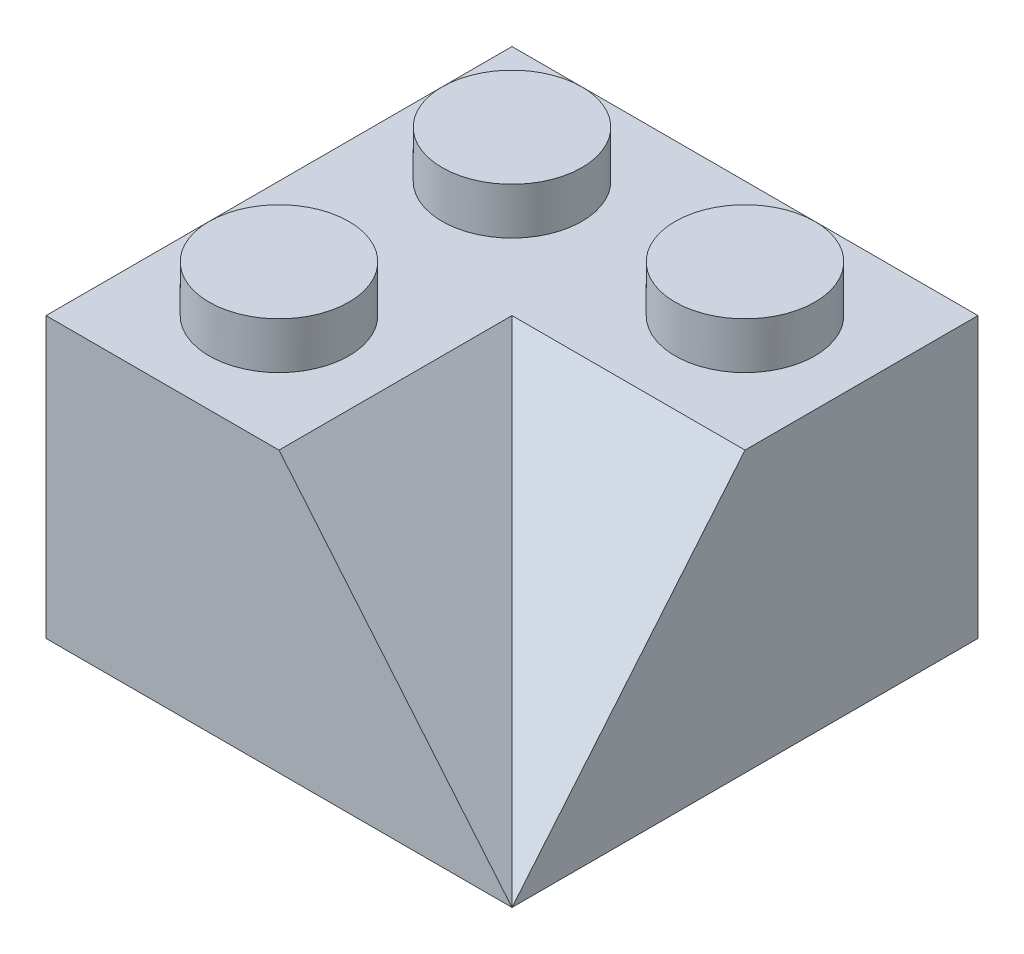
ISO-10303-21;
HEADER;
FILE_DESCRIPTION(('STEP AP214'),'2;1');
FILE_NAME('part.step','',(''),(''),'','','');
FILE_SCHEMA(('AUTOMOTIVE_DESIGN { 1 0 10303 214 1 1 1 1 }'));
ENDSEC;
DATA;
#1=APPLICATION_CONTEXT('core data for automotive mechanical design processes');
#2=APPLICATION_PROTOCOL_DEFINITION('international standard','automotive_design',2000,#1);
#3=PRODUCT_CONTEXT('',#1,'mechanical');
#4=PRODUCT('Part','Part','',(#3));
#5=PRODUCT_RELATED_PRODUCT_CATEGORY('part','',(#4));
#6=PRODUCT_DEFINITION_FORMATION('','',#4);
#7=PRODUCT_DEFINITION_CONTEXT('part definition',#1,'design');
#8=PRODUCT_DEFINITION('design','',#6,#7);
#9=PRODUCT_DEFINITION_SHAPE('','',#8);
#10=(LENGTH_UNIT() NAMED_UNIT(*) SI_UNIT(.MILLI.,.METRE.));
#11=(NAMED_UNIT(*) PLANE_ANGLE_UNIT() SI_UNIT($,.RADIAN.));
#12=(NAMED_UNIT(*) SI_UNIT($,.STERADIAN.) SOLID_ANGLE_UNIT());
#13=UNCERTAINTY_MEASURE_WITH_UNIT(LENGTH_MEASURE(1.E-05),#10,'distance_accuracy_value','');
#14=(GEOMETRIC_REPRESENTATION_CONTEXT(3) GLOBAL_UNCERTAINTY_ASSIGNED_CONTEXT((#13)) GLOBAL_UNIT_ASSIGNED_CONTEXT((#10,
#11,#12)) REPRESENTATION_CONTEXT('',''));
#15=CARTESIAN_POINT('',(0.,0.,0.));
#16=DIRECTION('',(0.,0.,1.));
#17=DIRECTION('',(1.,0.,0.));
#18=AXIS2_PLACEMENT_3D('',#15,#16,#17);
#19=CARTESIAN_POINT('',(0.,0.,0.));
#20=DIRECTION('',(0.,-1.,0.));
#21=DIRECTION('',(0.,0.,-1.));
#22=AXIS2_PLACEMENT_3D('',#19,#20,#21);
#23=PLANE('',#22);
#24=DIRECTION('',(0.,0.,1.));
#25=VECTOR('',#24,1.);
#26=CARTESIAN_POINT('',(0.,0.,0.));
#27=LINE('',#26,#25);
#28=CARTESIAN_POINT('',(0.,0.,-16.));
#29=VERTEX_POINT('',#28);
#30=CARTESIAN_POINT('',(0.,0.,0.));
#31=VERTEX_POINT('',#30);
#32=EDGE_CURVE('E220',#29,#31,#27,.T.);
#33=ORIENTED_EDGE('',*,*,#32,.F.);
#34=DIRECTION('',(-1.,0.,0.));
#35=VECTOR('',#34,1.);
#36=CARTESIAN_POINT('',(0.,0.,-16.));
#37=LINE('',#36,#35);
#38=CARTESIAN_POINT('',(16.,0.,-16.));
#39=VERTEX_POINT('',#38);
#40=EDGE_CURVE('E323',#39,#29,#37,.T.);
#41=ORIENTED_EDGE('',*,*,#40,.F.);
#42=DIRECTION('',(0.,0.,-1.));
#43=VECTOR('',#42,1.);
#44=CARTESIAN_POINT('',(16.,0.,0.));
#45=LINE('',#44,#43);
#46=CARTESIAN_POINT('',(16.,0.,0.));
#47=VERTEX_POINT('',#46);
#48=EDGE_CURVE('E330',#47,#39,#45,.T.);
#49=ORIENTED_EDGE('',*,*,#48,.F.);
#50=DIRECTION('',(1.,0.,0.));
#51=VECTOR('',#50,1.);
#52=CARTESIAN_POINT('',(0.,0.,0.));
#53=LINE('',#52,#51);
#54=EDGE_CURVE('E226',#31,#47,#53,.T.);
#55=ORIENTED_EDGE('',*,*,#54,.F.);
#56=EDGE_LOOP('',(#33,#41,#49,#55));
#57=FACE_BOUND('',#56,.T.);
#58=DIRECTION('',(-1.,0.,0.));
#59=VECTOR('',#58,1.);
#60=CARTESIAN_POINT('',(16.,0.,-14.4));
#61=LINE('',#60,#59);
#62=CARTESIAN_POINT('',(14.4,0.,-14.4));
#63=VERTEX_POINT('',#62);
#64=CARTESIAN_POINT('',(1.6,0.,-14.4));
#65=VERTEX_POINT('',#64);
#66=EDGE_CURVE('E201',#63,#65,#61,.T.);
#67=ORIENTED_EDGE('',*,*,#66,.T.);
#68=DIRECTION('',(0.,0.,1.));
#69=VECTOR('',#68,1.);
#70=CARTESIAN_POINT('',(1.6,0.,-16.));
#71=LINE('',#70,#69);
#72=CARTESIAN_POINT('',(1.6,0.,-1.6));
#73=VERTEX_POINT('',#72);
#74=EDGE_CURVE('E192',#65,#73,#71,.T.);
#75=ORIENTED_EDGE('',*,*,#74,.T.);
#76=DIRECTION('',(1.,0.,0.));
#77=VECTOR('',#76,1.);
#78=CARTESIAN_POINT('',(0.,0.,-1.6));
#79=LINE('',#78,#77);
#80=CARTESIAN_POINT('',(13.9172667530916,0.,-1.6));
#81=VERTEX_POINT('',#80);
#82=EDGE_CURVE('E173',#73,#81,#79,.T.);
#83=ORIENTED_EDGE('',*,*,#82,.T.);
#84=DIRECTION('',(0.,0.,-1.));
#85=VECTOR('',#84,1.);
#86=CARTESIAN_POINT('',(13.9172667530916,0.,0.));
#87=LINE('',#86,#85);
#88=CARTESIAN_POINT('',(13.9172667530916,0.,-2.08273324690844));
#89=VERTEX_POINT('',#88);
#90=EDGE_CURVE('E170',#81,#89,#87,.T.);
#91=ORIENTED_EDGE('',*,*,#90,.T.);
#92=DIRECTION('',(-1.,0.,0.));
#93=VECTOR('',#92,1.);
#94=CARTESIAN_POINT('',(0.,0.,-2.08273324690844));
#95=LINE('',#94,#93);
#96=CARTESIAN_POINT('',(14.4,0.,-2.08273324690844));
#97=VERTEX_POINT('',#96);
#98=EDGE_CURVE('E207',#97,#89,#95,.T.);
#99=ORIENTED_EDGE('',*,*,#98,.F.);
#100=DIRECTION('',(0.,0.,-1.));
#101=VECTOR('',#100,1.);
#102=CARTESIAN_POINT('',(14.4,0.,0.));
#103=LINE('',#102,#101);
#104=EDGE_CURVE('E177',#97,#63,#103,.T.);
#105=ORIENTED_EDGE('',*,*,#104,.T.);
#106=EDGE_LOOP('',(#67,#75,#83,#91,#99,#105));
#107=FACE_BOUND('',#106,.T.);
#108=ADVANCED_FACE('F66',(#57,#107),#23,.T.);
#109=CARTESIAN_POINT('',(0.,9.6,0.));
#110=DIRECTION('',(0.,-1.,0.));
#111=DIRECTION('',(0.,0.,-1.));
#112=AXIS2_PLACEMENT_3D('',#109,#110,#111);
#113=PLANE('',#112);
#114=CARTESIAN_POINT('',(12.,9.6,-12.));
#115=DIRECTION('',(0.,-1.,0.));
#116=DIRECTION('',(0.,0.,-1.));
#117=AXIS2_PLACEMENT_3D('',#114,#115,#116);
#118=CIRCLE('',#117,2.4);
#119=CARTESIAN_POINT('',(12.,9.6,-14.4));
#120=VERTEX_POINT('',#119);
#121=EDGE_CURVE('E13',#120,#120,#118,.F.);
#122=ORIENTED_EDGE('',*,*,#121,.F.);
#123=EDGE_LOOP('',(#122));
#124=FACE_BOUND('',#123,.T.);
#125=CARTESIAN_POINT('',(4.,9.6,-4.));
#126=DIRECTION('',(0.,-1.,0.));
#127=DIRECTION('',(0.,0.,-1.));
#128=AXIS2_PLACEMENT_3D('',#125,#126,#127);
#129=CIRCLE('',#128,2.4);
#130=CARTESIAN_POINT('',(4.,9.6,-6.4));
#131=VERTEX_POINT('',#130);
#132=EDGE_CURVE('E75',#131,#131,#129,.F.);
#133=ORIENTED_EDGE('',*,*,#132,.F.);
#134=EDGE_LOOP('',(#133));
#135=FACE_BOUND('',#134,.T.);
#136=CARTESIAN_POINT('',(4.,9.6,-12.));
#137=DIRECTION('',(0.,-1.,0.));
#138=DIRECTION('',(0.,0.,-1.));
#139=AXIS2_PLACEMENT_3D('',#136,#137,#138);
#140=CIRCLE('',#139,2.4);
#141=CARTESIAN_POINT('',(4.,9.6,-14.4));
#142=VERTEX_POINT('',#141);
#143=EDGE_CURVE('E400',#142,#142,#140,.F.);
#144=ORIENTED_EDGE('',*,*,#143,.F.);
#145=EDGE_LOOP('',(#144));
#146=FACE_BOUND('',#145,.T.);
#147=DIRECTION('',(0.,0.,1.));
#148=VECTOR('',#147,1.);
#149=CARTESIAN_POINT('',(0.,9.6,0.));
#150=LINE('',#149,#148);
#151=CARTESIAN_POINT('',(0.,9.6,-16.));
#152=VERTEX_POINT('',#151);
#153=CARTESIAN_POINT('',(0.,9.6,0.));
#154=VERTEX_POINT('',#153);
#155=EDGE_CURVE('E349',#152,#154,#150,.T.);
#156=ORIENTED_EDGE('',*,*,#155,.T.);
#157=DIRECTION('',(1.,0.,0.));
#158=VECTOR('',#157,1.);
#159=CARTESIAN_POINT('',(0.,9.6,0.));
#160=LINE('',#159,#158);
#161=CARTESIAN_POINT('',(8.,9.6,0.));
#162=VERTEX_POINT('',#161);
#163=EDGE_CURVE('E348',#154,#162,#160,.T.);
#164=ORIENTED_EDGE('',*,*,#163,.T.);
#165=DIRECTION('',(0.,0.,-1.));
#166=VECTOR('',#165,1.);
#167=CARTESIAN_POINT('',(8.,9.6,-8.));
#168=LINE('',#167,#166);
#169=CARTESIAN_POINT('',(8.,9.6,-8.));
#170=VERTEX_POINT('',#169);
#171=EDGE_CURVE('E268',#162,#170,#168,.T.);
#172=ORIENTED_EDGE('',*,*,#171,.T.);
#173=DIRECTION('',(1.,0.,0.));
#174=VECTOR('',#173,1.);
#175=CARTESIAN_POINT('',(16.,9.6,-8.));
#176=LINE('',#175,#174);
#177=CARTESIAN_POINT('',(16.,9.6,-8.));
#178=VERTEX_POINT('',#177);
#179=EDGE_CURVE('E281',#170,#178,#176,.T.);
#180=ORIENTED_EDGE('',*,*,#179,.T.);
#181=DIRECTION('',(0.,0.,-1.));
#182=VECTOR('',#181,1.);
#183=CARTESIAN_POINT('',(16.,9.6,-16.));
#184=LINE('',#183,#182);
#185=CARTESIAN_POINT('',(16.,9.6,-16.));
#186=VERTEX_POINT('',#185);
#187=EDGE_CURVE('E434',#178,#186,#184,.T.);
#188=ORIENTED_EDGE('',*,*,#187,.T.);
#189=DIRECTION('',(-1.,0.,0.));
#190=VECTOR('',#189,1.);
#191=CARTESIAN_POINT('',(0.,9.6,-16.));
#192=LINE('',#191,#190);
#193=EDGE_CURVE('E90',#186,#152,#192,.T.);
#194=ORIENTED_EDGE('',*,*,#193,.T.);
#195=EDGE_LOOP('',(#156,#164,#172,#180,#188,#194));
#196=FACE_BOUND('',#195,.T.);
#197=ADVANCED_FACE('F68',(#124,#135,#146,#196),#113,.F.);
#198=CARTESIAN_POINT('',(16.,0.,0.));
#199=DIRECTION('',(0.,0.64018439966448,0.768221279597376));
#200=DIRECTION('',(0.,0.768221279597376,-0.64018439966448));
#201=AXIS2_PLACEMENT_3D('',#198,#199,#200);
#202=PLANE('',#201);
#203=DIRECTION('',(-0.539163866017192,0.646996639220631,-0.539163866017192));
#204=VECTOR('',#203,1.);
#205=CARTESIAN_POINT('',(12.,4.8,-4.));
#206=LINE('',#205,#204);
#207=EDGE_CURVE('E470',#47,#170,#206,.T.);
#208=ORIENTED_EDGE('',*,*,#207,.F.);
#209=DIRECTION('',(0.,0.768221279597376,-0.64018439966448));
#210=VECTOR('',#209,1.);
#211=CARTESIAN_POINT('',(16.,4.8,-4.));
#212=LINE('',#211,#210);
#213=EDGE_CURVE('E355',#47,#178,#212,.T.);
#214=ORIENTED_EDGE('',*,*,#213,.T.);
#215=ORIENTED_EDGE('',*,*,#179,.F.);
#216=EDGE_LOOP('',(#208,#214,#215));
#217=FACE_BOUND('',#216,.T.);
#218=ADVANCED_FACE('F287',(#217),#202,.T.);
#219=CARTESIAN_POINT('',(16.,0.,0.));
#220=DIRECTION('',(0.768221279597376,0.64018439966448,0.));
#221=DIRECTION('',(-0.539163866017192,0.64699663922063,-0.539163866017192));
#222=AXIS2_PLACEMENT_3D('',#219,#220,#221);
#223=PLANE('',#222);
#224=DIRECTION('',(-0.64018439966448,0.768221279597376,0.));
#225=VECTOR('',#224,1.);
#226=CARTESIAN_POINT('',(12.,4.8,0.));
#227=LINE('',#226,#225);
#228=EDGE_CURVE('E340',#47,#162,#227,.T.);
#229=ORIENTED_EDGE('',*,*,#228,.F.);
#230=ORIENTED_EDGE('',*,*,#207,.T.);
#231=ORIENTED_EDGE('',*,*,#171,.F.);
#232=EDGE_LOOP('',(#229,#230,#231));
#233=FACE_BOUND('',#232,.T.);
#234=ADVANCED_FACE('F245',(#233),#223,.T.);
#235=CARTESIAN_POINT('',(0.,0.,0.));
#236=DIRECTION('',(0.,0.,1.));
#237=DIRECTION('',(1.,0.,0.));
#238=AXIS2_PLACEMENT_3D('',#235,#236,#237);
#239=PLANE('',#238);
#240=ORIENTED_EDGE('',*,*,#54,.T.);
#241=ORIENTED_EDGE('',*,*,#228,.T.);
#242=ORIENTED_EDGE('',*,*,#163,.F.);
#243=DIRECTION('',(0.,1.,0.));
#244=VECTOR('',#243,1.);
#245=CARTESIAN_POINT('',(0.,4.8,0.));
#246=LINE('',#245,#244);
#247=EDGE_CURVE('E232',#31,#154,#246,.T.);
#248=ORIENTED_EDGE('',*,*,#247,.F.);
#249=EDGE_LOOP('',(#240,#241,#242,#248));
#250=FACE_BOUND('',#249,.T.);
#251=ADVANCED_FACE('F234',(#250),#239,.T.);
#252=CARTESIAN_POINT('',(0.,0.,-16.));
#253=DIRECTION('',(-1.,0.,0.));
#254=DIRECTION('',(0.,0.,1.));
#255=AXIS2_PLACEMENT_3D('',#252,#253,#254);
#256=PLANE('',#255);
#257=ORIENTED_EDGE('',*,*,#32,.T.);
#258=ORIENTED_EDGE('',*,*,#247,.T.);
#259=ORIENTED_EDGE('',*,*,#155,.F.);
#260=DIRECTION('',(0.,1.,0.));
#261=VECTOR('',#260,1.);
#262=CARTESIAN_POINT('',(0.,4.8,-16.));
#263=LINE('',#262,#261);
#264=EDGE_CURVE('E346',#29,#152,#263,.T.);
#265=ORIENTED_EDGE('',*,*,#264,.F.);
#266=EDGE_LOOP('',(#257,#258,#259,#265));
#267=FACE_BOUND('',#266,.T.);
#268=ADVANCED_FACE('F244',(#267),#256,.T.);
#269=CARTESIAN_POINT('',(16.,0.,-16.));
#270=DIRECTION('',(0.,0.,-1.));
#271=DIRECTION('',(-1.,0.,0.));
#272=AXIS2_PLACEMENT_3D('',#269,#270,#271);
#273=PLANE('',#272);
#274=ORIENTED_EDGE('',*,*,#40,.T.);
#275=ORIENTED_EDGE('',*,*,#264,.T.);
#276=ORIENTED_EDGE('',*,*,#193,.F.);
#277=DIRECTION('',(0.,1.,0.));
#278=VECTOR('',#277,1.);
#279=CARTESIAN_POINT('',(16.,4.8,-16.));
#280=LINE('',#279,#278);
#281=EDGE_CURVE('E351',#39,#186,#280,.T.);
#282=ORIENTED_EDGE('',*,*,#281,.F.);
#283=EDGE_LOOP('',(#274,#275,#276,#282));
#284=FACE_BOUND('',#283,.T.);
#285=ADVANCED_FACE('F363',(#284),#273,.T.);
#286=CARTESIAN_POINT('',(16.,0.,0.));
#287=DIRECTION('',(1.,0.,0.));
#288=DIRECTION('',(0.,0.,-1.));
#289=AXIS2_PLACEMENT_3D('',#286,#287,#288);
#290=PLANE('',#289);
#291=ORIENTED_EDGE('',*,*,#48,.T.);
#292=ORIENTED_EDGE('',*,*,#281,.T.);
#293=ORIENTED_EDGE('',*,*,#187,.F.);
#294=ORIENTED_EDGE('',*,*,#213,.F.);
#295=EDGE_LOOP('',(#291,#292,#293,#294));
#296=FACE_BOUND('',#295,.T.);
#297=ADVANCED_FACE('F371',(#296),#290,.T.);
#298=CARTESIAN_POINT('',(4.,11.2,-12.));
#299=DIRECTION('',(0.,-1.,0.));
#300=DIRECTION('',(0.,0.,-1.));
#301=AXIS2_PLACEMENT_3D('',#298,#299,#300);
#302=CYLINDRICAL_SURFACE('',#301,2.4);
#303=CARTESIAN_POINT('',(4.,11.2,-12.));
#304=DIRECTION('',(0.,1.,0.));
#305=DIRECTION('',(0.,0.,1.));
#306=AXIS2_PLACEMENT_3D('',#303,#304,#305);
#307=CIRCLE('',#306,2.4);
#308=CARTESIAN_POINT('',(4.,11.2,-9.6));
#309=VERTEX_POINT('',#308);
#310=EDGE_CURVE('E217',#309,#309,#307,.T.);
#311=ORIENTED_EDGE('',*,*,#310,.F.);
#312=EDGE_LOOP('',(#311));
#313=FACE_BOUND('',#312,.T.);
#314=ORIENTED_EDGE('',*,*,#143,.T.);
#315=EDGE_LOOP('',(#314));
#316=FACE_BOUND('',#315,.T.);
#317=ADVANCED_FACE('F300',(#313,#316),#302,.T.);
#318=CARTESIAN_POINT('',(4.,11.2,-12.));
#319=DIRECTION('',(0.,1.,0.));
#320=DIRECTION('',(0.,0.,1.));
#321=AXIS2_PLACEMENT_3D('',#318,#319,#320);
#322=PLANE('',#321);
#323=ORIENTED_EDGE('',*,*,#310,.T.);
#324=EDGE_LOOP('',(#323));
#325=FACE_BOUND('',#324,.T.);
#326=ADVANCED_FACE('F418',(#325),#322,.T.);
#327=CARTESIAN_POINT('',(4.,11.2,-4.));
#328=DIRECTION('',(0.,-1.,0.));
#329=DIRECTION('',(0.,0.,-1.));
#330=AXIS2_PLACEMENT_3D('',#327,#328,#329);
#331=CYLINDRICAL_SURFACE('',#330,2.4);
#332=CARTESIAN_POINT('',(4.,11.2,-4.));
#333=DIRECTION('',(0.,1.,0.));
#334=DIRECTION('',(0.,0.,1.));
#335=AXIS2_PLACEMENT_3D('',#332,#333,#334);
#336=CIRCLE('',#335,2.4);
#337=CARTESIAN_POINT('',(4.,11.2,-1.6));
#338=VERTEX_POINT('',#337);
#339=EDGE_CURVE('E214',#338,#338,#336,.T.);
#340=ORIENTED_EDGE('',*,*,#339,.F.);
#341=EDGE_LOOP('',(#340));
#342=FACE_BOUND('',#341,.T.);
#343=ORIENTED_EDGE('',*,*,#132,.T.);
#344=EDGE_LOOP('',(#343));
#345=FACE_BOUND('',#344,.T.);
#346=ADVANCED_FACE('F410',(#342,#345),#331,.T.);
#347=CARTESIAN_POINT('',(4.,11.2,-4.));
#348=DIRECTION('',(0.,1.,0.));
#349=DIRECTION('',(0.,0.,1.));
#350=AXIS2_PLACEMENT_3D('',#347,#348,#349);
#351=PLANE('',#350);
#352=ORIENTED_EDGE('',*,*,#339,.T.);
#353=EDGE_LOOP('',(#352));
#354=FACE_BOUND('',#353,.T.);
#355=ADVANCED_FACE('F521',(#354),#351,.T.);
#356=CARTESIAN_POINT('',(12.,11.2,-12.));
#357=DIRECTION('',(0.,-1.,0.));
#358=DIRECTION('',(0.,0.,-1.));
#359=AXIS2_PLACEMENT_3D('',#356,#357,#358);
#360=CYLINDRICAL_SURFACE('',#359,2.4);
#361=CARTESIAN_POINT('',(12.,11.2,-12.));
#362=DIRECTION('',(0.,1.,0.));
#363=DIRECTION('',(0.,0.,1.));
#364=AXIS2_PLACEMENT_3D('',#361,#362,#363);
#365=CIRCLE('',#364,2.4);
#366=CARTESIAN_POINT('',(12.,11.2,-9.6));
#367=VERTEX_POINT('',#366);
#368=EDGE_CURVE('E211',#367,#367,#365,.T.);
#369=ORIENTED_EDGE('',*,*,#368,.F.);
#370=EDGE_LOOP('',(#369));
#371=FACE_BOUND('',#370,.T.);
#372=ORIENTED_EDGE('',*,*,#121,.T.);
#373=EDGE_LOOP('',(#372));
#374=FACE_BOUND('',#373,.T.);
#375=ADVANCED_FACE('F531',(#371,#374),#360,.T.);
#376=CARTESIAN_POINT('',(12.,11.2,-12.));
#377=DIRECTION('',(0.,1.,0.));
#378=DIRECTION('',(0.,0.,1.));
#379=AXIS2_PLACEMENT_3D('',#376,#377,#378);
#380=PLANE('',#379);
#381=ORIENTED_EDGE('',*,*,#368,.T.);
#382=EDGE_LOOP('',(#381));
#383=FACE_BOUND('',#382,.T.);
#384=ADVANCED_FACE('F548',(#383),#380,.T.);
#385=CARTESIAN_POINT('',(0.,8.,0.));
#386=DIRECTION('',(0.,-1.,0.));
#387=DIRECTION('',(0.,0.,-1.));
#388=AXIS2_PLACEMENT_3D('',#385,#386,#387);
#389=PLANE('',#388);
#390=CARTESIAN_POINT('',(12.,8.,-12.));
#391=DIRECTION('',(0.,-1.,0.));
#392=DIRECTION('',(0.,0.,-1.));
#393=AXIS2_PLACEMENT_3D('',#390,#391,#392);
#394=CIRCLE('',#393,0.8);
#395=CARTESIAN_POINT('',(12.,8.,-12.8));
#396=VERTEX_POINT('',#395);
#397=EDGE_CURVE('E208',#396,#396,#394,.F.);
#398=ORIENTED_EDGE('',*,*,#397,.T.);
#399=EDGE_LOOP('',(#398));
#400=FACE_BOUND('',#399,.T.);
#401=CARTESIAN_POINT('',(4.,8.,-4.));
#402=DIRECTION('',(0.,-1.,0.));
#403=DIRECTION('',(0.,0.,-1.));
#404=AXIS2_PLACEMENT_3D('',#401,#402,#403);
#405=CIRCLE('',#404,0.8);
#406=CARTESIAN_POINT('',(4.,8.,-4.8));
#407=VERTEX_POINT('',#406);
#408=EDGE_CURVE('E697',#407,#407,#405,.F.);
#409=ORIENTED_EDGE('',*,*,#408,.T.);
#410=EDGE_LOOP('',(#409));
#411=FACE_BOUND('',#410,.T.);
#412=CARTESIAN_POINT('',(4.,8.,-12.));
#413=DIRECTION('',(0.,-1.,0.));
#414=DIRECTION('',(0.,0.,-1.));
#415=AXIS2_PLACEMENT_3D('',#412,#413,#414);
#416=CIRCLE('',#415,0.8);
#417=CARTESIAN_POINT('',(4.,8.,-12.8));
#418=VERTEX_POINT('',#417);
#419=EDGE_CURVE('E158',#418,#418,#416,.F.);
#420=ORIENTED_EDGE('',*,*,#419,.T.);
#421=EDGE_LOOP('',(#420));
#422=FACE_BOUND('',#421,.T.);
#423=DIRECTION('',(0.,0.,1.));
#424=VECTOR('',#423,1.);
#425=CARTESIAN_POINT('',(1.6,8.,-16.));
#426=LINE('',#425,#424);
#427=CARTESIAN_POINT('',(1.6,8.,-14.4));
#428=VERTEX_POINT('',#427);
#429=CARTESIAN_POINT('',(1.6,8.,-1.6));
#430=VERTEX_POINT('',#429);
#431=EDGE_CURVE('E182',#428,#430,#426,.T.);
#432=ORIENTED_EDGE('',*,*,#431,.F.);
#433=DIRECTION('',(-1.,0.,0.));
#434=VECTOR('',#433,1.);
#435=CARTESIAN_POINT('',(16.,8.,-14.4));
#436=LINE('',#435,#434);
#437=CARTESIAN_POINT('',(14.4,8.,-14.4));
#438=VERTEX_POINT('',#437);
#439=EDGE_CURVE('E704',#438,#428,#436,.T.);
#440=ORIENTED_EDGE('',*,*,#439,.F.);
#441=DIRECTION('',(0.,0.,-1.));
#442=VECTOR('',#441,1.);
#443=CARTESIAN_POINT('',(14.4,8.,0.));
#444=LINE('',#443,#442);
#445=CARTESIAN_POINT('',(14.4,8.,-8.74939991357511));
#446=VERTEX_POINT('',#445);
#447=EDGE_CURVE('E707',#446,#438,#444,.T.);
#448=ORIENTED_EDGE('',*,*,#447,.F.);
#449=DIRECTION('',(1.,0.,0.));
#450=VECTOR('',#449,1.);
#451=CARTESIAN_POINT('',(16.,8.,-8.74939991357511));
#452=LINE('',#451,#450);
#453=CARTESIAN_POINT('',(7.25060008642489,8.,-8.74939991357511));
#454=VERTEX_POINT('',#453);
#455=EDGE_CURVE('E164',#454,#446,#452,.T.);
#456=ORIENTED_EDGE('',*,*,#455,.F.);
#457=DIRECTION('',(0.,0.,-1.));
#458=VECTOR('',#457,1.);
#459=CARTESIAN_POINT('',(7.25060008642489,8.,0.));
#460=LINE('',#459,#458);
#461=CARTESIAN_POINT('',(7.25060008642489,8.,-1.6));
#462=VERTEX_POINT('',#461);
#463=EDGE_CURVE('E159',#462,#454,#460,.T.);
#464=ORIENTED_EDGE('',*,*,#463,.F.);
#465=DIRECTION('',(1.,0.,0.));
#466=VECTOR('',#465,1.);
#467=CARTESIAN_POINT('',(0.,8.,-1.6));
#468=LINE('',#467,#466);
#469=EDGE_CURVE('E150',#430,#462,#468,.T.);
#470=ORIENTED_EDGE('',*,*,#469,.F.);
#471=EDGE_LOOP('',(#432,#440,#448,#456,#464,#470));
#472=FACE_BOUND('',#471,.T.);
#473=ADVANCED_FACE('F162',(#400,#411,#422,#472),#389,.T.);
#474=CARTESIAN_POINT('',(16.,-1.02429503946317,-1.2291540473558));
#475=DIRECTION('',(0.,0.64018439966448,0.768221279597376));
#476=DIRECTION('',(0.,0.768221279597376,-0.64018439966448));
#477=AXIS2_PLACEMENT_3D('',#474,#475,#476);
#478=PLANE('',#477);
#479=DIRECTION('',(-0.539163866017192,0.64699663922063,-0.539163866017192));
#480=VECTOR('',#479,1.);
#481=CARTESIAN_POINT('',(15.1281581757127,-1.45306970714542,-0.871841824287254));
#482=LINE('',#481,#480);
#483=EDGE_CURVE('E172',#89,#454,#482,.T.);
#484=ORIENTED_EDGE('',*,*,#483,.T.);
#485=ORIENTED_EDGE('',*,*,#455,.T.);
#486=DIRECTION('',(0.,0.768221279597376,-0.64018439966448));
#487=VECTOR('',#486,1.);
#488=CARTESIAN_POINT('',(14.4,-1.02429503946317,-1.2291540473558));
#489=LINE('',#488,#487);
#490=EDGE_CURVE('E175',#97,#446,#489,.T.);
#491=ORIENTED_EDGE('',*,*,#490,.F.);
#492=ORIENTED_EDGE('',*,*,#98,.T.);
#493=EDGE_LOOP('',(#484,#485,#491,#492));
#494=FACE_BOUND('',#493,.T.);
#495=ADVANCED_FACE('F571',(#494),#478,.F.);
#496=CARTESIAN_POINT('',(14.7708459526442,-1.02429503946317,0.));
#497=DIRECTION('',(0.768221279597376,0.64018439966448,0.));
#498=DIRECTION('',(-0.539163866017192,0.64699663922063,-0.539163866017192));
#499=AXIS2_PLACEMENT_3D('',#496,#497,#498);
#500=PLANE('',#499);
#501=DIRECTION('',(-0.64018439966448,0.768221279597376,0.));
#502=VECTOR('',#501,1.);
#503=CARTESIAN_POINT('',(8.21346890346387,6.84455741955323,-1.6));
#504=LINE('',#503,#502);
#505=EDGE_CURVE('E82',#81,#462,#504,.T.);
#506=ORIENTED_EDGE('',*,*,#505,.T.);
#507=ORIENTED_EDGE('',*,*,#463,.T.);
#508=ORIENTED_EDGE('',*,*,#483,.F.);
#509=ORIENTED_EDGE('',*,*,#90,.F.);
#510=EDGE_LOOP('',(#506,#507,#508,#509));
#511=FACE_BOUND('',#510,.T.);
#512=ADVANCED_FACE('F168',(#511),#500,.F.);
#513=CARTESIAN_POINT('',(0.,0.,-1.6));
#514=DIRECTION('',(0.,0.,1.));
#515=DIRECTION('',(1.,0.,0.));
#516=AXIS2_PLACEMENT_3D('',#513,#514,#515);
#517=PLANE('',#516);
#518=ORIENTED_EDGE('',*,*,#82,.F.);
#519=DIRECTION('',(0.,1.,0.));
#520=VECTOR('',#519,1.);
#521=CARTESIAN_POINT('',(1.6,0.,-1.6));
#522=LINE('',#521,#520);
#523=EDGE_CURVE('E154',#73,#430,#522,.T.);
#524=ORIENTED_EDGE('',*,*,#523,.T.);
#525=ORIENTED_EDGE('',*,*,#469,.T.);
#526=ORIENTED_EDGE('',*,*,#505,.F.);
#527=EDGE_LOOP('',(#518,#524,#525,#526));
#528=FACE_BOUND('',#527,.T.);
#529=ADVANCED_FACE('F152',(#528),#517,.F.);
#530=CARTESIAN_POINT('',(1.6,0.,-16.));
#531=DIRECTION('',(-1.,0.,0.));
#532=DIRECTION('',(0.,0.,1.));
#533=AXIS2_PLACEMENT_3D('',#530,#531,#532);
#534=PLANE('',#533);
#535=ORIENTED_EDGE('',*,*,#74,.F.);
#536=DIRECTION('',(0.,1.,0.));
#537=VECTOR('',#536,1.);
#538=CARTESIAN_POINT('',(1.6,0.,-14.4));
#539=LINE('',#538,#537);
#540=EDGE_CURVE('E183',#65,#428,#539,.T.);
#541=ORIENTED_EDGE('',*,*,#540,.T.);
#542=ORIENTED_EDGE('',*,*,#431,.T.);
#543=ORIENTED_EDGE('',*,*,#523,.F.);
#544=EDGE_LOOP('',(#535,#541,#542,#543));
#545=FACE_BOUND('',#544,.T.);
#546=ADVANCED_FACE('F595',(#545),#534,.F.);
#547=CARTESIAN_POINT('',(16.,0.,-14.4));
#548=DIRECTION('',(0.,0.,-1.));
#549=DIRECTION('',(-1.,0.,0.));
#550=AXIS2_PLACEMENT_3D('',#547,#548,#549);
#551=PLANE('',#550);
#552=ORIENTED_EDGE('',*,*,#66,.F.);
#553=DIRECTION('',(0.,1.,0.));
#554=VECTOR('',#553,1.);
#555=CARTESIAN_POINT('',(14.4,0.,-14.4));
#556=LINE('',#555,#554);
#557=EDGE_CURVE('E186',#63,#438,#556,.T.);
#558=ORIENTED_EDGE('',*,*,#557,.T.);
#559=ORIENTED_EDGE('',*,*,#439,.T.);
#560=ORIENTED_EDGE('',*,*,#540,.F.);
#561=EDGE_LOOP('',(#552,#558,#559,#560));
#562=FACE_BOUND('',#561,.T.);
#563=ADVANCED_FACE('F603',(#562),#551,.F.);
#564=CARTESIAN_POINT('',(14.4,0.,0.));
#565=DIRECTION('',(1.,0.,0.));
#566=DIRECTION('',(0.,0.,-1.));
#567=AXIS2_PLACEMENT_3D('',#564,#565,#566);
#568=PLANE('',#567);
#569=ORIENTED_EDGE('',*,*,#104,.F.);
#570=ORIENTED_EDGE('',*,*,#490,.T.);
#571=ORIENTED_EDGE('',*,*,#447,.T.);
#572=ORIENTED_EDGE('',*,*,#557,.F.);
#573=EDGE_LOOP('',(#569,#570,#571,#572));
#574=FACE_BOUND('',#573,.T.);
#575=ADVANCED_FACE('F612',(#574),#568,.F.);
#576=CARTESIAN_POINT('',(4.,11.2,-12.));
#577=DIRECTION('',(0.,-1.,0.));
#578=DIRECTION('',(0.,0.,-1.));
#579=AXIS2_PLACEMENT_3D('',#576,#577,#578);
#580=CYLINDRICAL_SURFACE('',#579,0.8);
#581=CARTESIAN_POINT('',(4.,9.6,-12.));
#582=DIRECTION('',(0.,1.,0.));
#583=DIRECTION('',(0.,0.,1.));
#584=AXIS2_PLACEMENT_3D('',#581,#582,#583);
#585=CIRCLE('',#584,0.8);
#586=CARTESIAN_POINT('',(4.,9.6,-11.2));
#587=VERTEX_POINT('',#586);
#588=EDGE_CURVE('E189',#587,#587,#585,.T.);
#589=ORIENTED_EDGE('',*,*,#588,.T.);
#590=EDGE_LOOP('',(#589));
#591=FACE_BOUND('',#590,.T.);
#592=ORIENTED_EDGE('',*,*,#419,.F.);
#593=EDGE_LOOP('',(#592));
#594=FACE_BOUND('',#593,.T.);
#595=ADVANCED_FACE('F621',(#591,#594),#580,.F.);
#596=CARTESIAN_POINT('',(4.,9.6,-12.));
#597=DIRECTION('',(0.,1.,0.));
#598=DIRECTION('',(0.,0.,1.));
#599=AXIS2_PLACEMENT_3D('',#596,#597,#598);
#600=PLANE('',#599);
#601=ORIENTED_EDGE('',*,*,#588,.F.);
#602=EDGE_LOOP('',(#601));
#603=FACE_BOUND('',#602,.T.);
#604=ADVANCED_FACE('F630',(#603),#600,.F.);
#605=CARTESIAN_POINT('',(4.,11.2,-4.));
#606=DIRECTION('',(0.,-1.,0.));
#607=DIRECTION('',(0.,0.,-1.));
#608=AXIS2_PLACEMENT_3D('',#605,#606,#607);
#609=CYLINDRICAL_SURFACE('',#608,0.8);
#610=CARTESIAN_POINT('',(4.,9.6,-4.));
#611=DIRECTION('',(0.,1.,0.));
#612=DIRECTION('',(0.,0.,1.));
#613=AXIS2_PLACEMENT_3D('',#610,#611,#612);
#614=CIRCLE('',#613,0.8);
#615=CARTESIAN_POINT('',(4.,9.6,-3.2));
#616=VERTEX_POINT('',#615);
#617=EDGE_CURVE('E193',#616,#616,#614,.T.);
#618=ORIENTED_EDGE('',*,*,#617,.T.);
#619=EDGE_LOOP('',(#618));
#620=FACE_BOUND('',#619,.T.);
#621=ORIENTED_EDGE('',*,*,#408,.F.);
#622=EDGE_LOOP('',(#621));
#623=FACE_BOUND('',#622,.T.);
#624=ADVANCED_FACE('F639',(#620,#623),#609,.F.);
#625=CARTESIAN_POINT('',(4.,9.6,-4.));
#626=DIRECTION('',(0.,1.,0.));
#627=DIRECTION('',(0.,0.,1.));
#628=AXIS2_PLACEMENT_3D('',#625,#626,#627);
#629=PLANE('',#628);
#630=ORIENTED_EDGE('',*,*,#617,.F.);
#631=EDGE_LOOP('',(#630));
#632=FACE_BOUND('',#631,.T.);
#633=ADVANCED_FACE('F648',(#632),#629,.F.);
#634=CARTESIAN_POINT('',(12.,11.2,-12.));
#635=DIRECTION('',(0.,-1.,0.));
#636=DIRECTION('',(0.,0.,-1.));
#637=AXIS2_PLACEMENT_3D('',#634,#635,#636);
#638=CYLINDRICAL_SURFACE('',#637,0.8);
#639=CARTESIAN_POINT('',(12.,9.6,-12.));
#640=DIRECTION('',(0.,1.,0.));
#641=DIRECTION('',(0.,0.,1.));
#642=AXIS2_PLACEMENT_3D('',#639,#640,#641);
#643=CIRCLE('',#642,0.8);
#644=CARTESIAN_POINT('',(12.,9.6,-11.2));
#645=VERTEX_POINT('',#644);
#646=EDGE_CURVE('E196',#645,#645,#643,.T.);
#647=ORIENTED_EDGE('',*,*,#646,.T.);
#648=EDGE_LOOP('',(#647));
#649=FACE_BOUND('',#648,.T.);
#650=ORIENTED_EDGE('',*,*,#397,.F.);
#651=EDGE_LOOP('',(#650));
#652=FACE_BOUND('',#651,.T.);
#653=ADVANCED_FACE('F657',(#649,#652),#638,.F.);
#654=CARTESIAN_POINT('',(12.,9.6,-12.));
#655=DIRECTION('',(0.,1.,0.));
#656=DIRECTION('',(0.,0.,1.));
#657=AXIS2_PLACEMENT_3D('',#654,#655,#656);
#658=PLANE('',#657);
#659=ORIENTED_EDGE('',*,*,#646,.F.);
#660=EDGE_LOOP('',(#659));
#661=FACE_BOUND('',#660,.T.);
#662=ADVANCED_FACE('F666',(#661),#658,.F.);
#663=CLOSED_SHELL('',(#108,#197,#218,#234,#251,#268,#285,#297,#317,#326,#346,#355,#375,#384,
#473,#495,#512,#529,#546,#563,#575,#595,#604,#624,#633,#653,#662));
#664=MANIFOLD_SOLID_BREP('B2',#663);
#665=ADVANCED_BREP_SHAPE_REPRESENTATION('',(#18,#664),#14);
#666=SHAPE_DEFINITION_REPRESENTATION(#9,#665);
ENDSEC;
END-ISO-10303-21;
